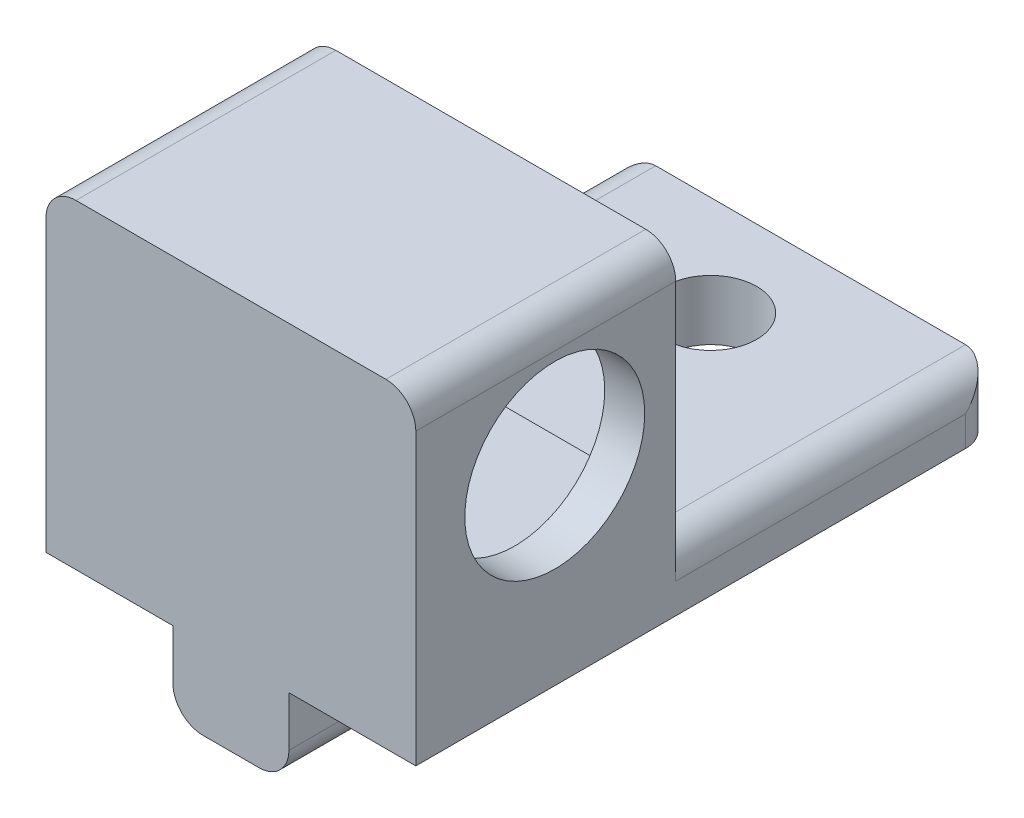
ISO-10303-21;
HEADER;
FILE_DESCRIPTION(('STEP AP214'),'2;1');
FILE_NAME('part.step','',(''),(''),'','','');
FILE_SCHEMA(('AUTOMOTIVE_DESIGN { 1 0 10303 214 1 1 1 1 }'));
ENDSEC;
DATA;
#1=APPLICATION_CONTEXT('core data for automotive mechanical design processes');
#2=APPLICATION_PROTOCOL_DEFINITION('international standard','automotive_design',2000,#1);
#3=PRODUCT_CONTEXT('',#1,'mechanical');
#4=PRODUCT('Part','Part','',(#3));
#5=PRODUCT_RELATED_PRODUCT_CATEGORY('part','',(#4));
#6=PRODUCT_DEFINITION_FORMATION('','',#4);
#7=PRODUCT_DEFINITION_CONTEXT('part definition',#1,'design');
#8=PRODUCT_DEFINITION('design','',#6,#7);
#9=PRODUCT_DEFINITION_SHAPE('','',#8);
#10=(LENGTH_UNIT() NAMED_UNIT(*) SI_UNIT(.MILLI.,.METRE.));
#11=(NAMED_UNIT(*) PLANE_ANGLE_UNIT() SI_UNIT($,.RADIAN.));
#12=(NAMED_UNIT(*) SI_UNIT($,.STERADIAN.) SOLID_ANGLE_UNIT());
#13=UNCERTAINTY_MEASURE_WITH_UNIT(LENGTH_MEASURE(1.E-05),#10,'distance_accuracy_value','');
#14=(GEOMETRIC_REPRESENTATION_CONTEXT(3) GLOBAL_UNCERTAINTY_ASSIGNED_CONTEXT((#13)) GLOBAL_UNIT_ASSIGNED_CONTEXT((#10,
#11,#12)) REPRESENTATION_CONTEXT('',''));
#15=CARTESIAN_POINT('',(0.,0.,0.));
#16=DIRECTION('',(0.,0.,1.));
#17=DIRECTION('',(1.,0.,0.));
#18=AXIS2_PLACEMENT_3D('',#15,#16,#17);
#19=CARTESIAN_POINT('',(0.,0.,0.));
#20=DIRECTION('',(0.,0.,-1.));
#21=DIRECTION('',(-1.,0.,0.));
#22=AXIS2_PLACEMENT_3D('',#19,#20,#21);
#23=PLANE('',#22);
#24=DIRECTION('',(-1.,0.,0.));
#25=VECTOR('',#24,1.);
#26=CARTESIAN_POINT('',(-2.,11.2,0.));
#27=LINE('',#26,#25);
#28=CARTESIAN_POINT('',(15.,11.2,0.));
#29=VERTEX_POINT('',#28);
#30=CARTESIAN_POINT('',(-0.5,11.2,0.));
#31=VERTEX_POINT('',#30);
#32=EDGE_CURVE('E271',#29,#31,#27,.T.);
#33=ORIENTED_EDGE('',*,*,#32,.F.);
#34=CARTESIAN_POINT('',(15.,9.7,0.));
#35=DIRECTION('',(0.,0.,-1.));
#36=DIRECTION('',(-1.,0.,0.));
#37=AXIS2_PLACEMENT_3D('',#34,#35,#36);
#38=CIRCLE('',#37,1.5);
#39=CARTESIAN_POINT('',(16.5,9.7,0.));
#40=VERTEX_POINT('',#39);
#41=EDGE_CURVE('E66',#29,#40,#38,.T.);
#42=ORIENTED_EDGE('',*,*,#41,.T.);
#43=DIRECTION('',(0.,1.,0.));
#44=VECTOR('',#43,1.);
#45=CARTESIAN_POINT('',(16.5,-1.8,0.));
#46=LINE('',#45,#44);
#47=CARTESIAN_POINT('',(16.5,-3.3,0.));
#48=VERTEX_POINT('',#47);
#49=EDGE_CURVE('E268',#48,#40,#46,.T.);
#50=ORIENTED_EDGE('',*,*,#49,.F.);
#51=CARTESIAN_POINT('',(15.,-3.3,0.));
#52=DIRECTION('',(0.,0.,-1.));
#53=DIRECTION('',(-1.,0.,0.));
#54=AXIS2_PLACEMENT_3D('',#51,#52,#53);
#55=CIRCLE('',#54,1.5);
#56=CARTESIAN_POINT('',(15.,-1.8,0.));
#57=VERTEX_POINT('',#56);
#58=EDGE_CURVE('E11',#48,#57,#55,.F.);
#59=ORIENTED_EDGE('',*,*,#58,.T.);
#60=DIRECTION('',(1.,0.,0.));
#61=VECTOR('',#60,1.);
#62=CARTESIAN_POINT('',(-2.,-1.8,0.));
#63=LINE('',#62,#61);
#64=CARTESIAN_POINT('',(-0.5,-1.8,0.));
#65=VERTEX_POINT('',#64);
#66=EDGE_CURVE('E261',#65,#57,#63,.T.);
#67=ORIENTED_EDGE('',*,*,#66,.F.);
#68=CARTESIAN_POINT('',(-0.5,-3.3,0.));
#69=DIRECTION('',(0.,0.,-1.));
#70=DIRECTION('',(-1.,0.,0.));
#71=AXIS2_PLACEMENT_3D('',#68,#69,#70);
#72=CIRCLE('',#71,1.5);
#73=CARTESIAN_POINT('',(-2.,-3.3,0.));
#74=VERTEX_POINT('',#73);
#75=EDGE_CURVE('E50',#65,#74,#72,.F.);
#76=ORIENTED_EDGE('',*,*,#75,.T.);
#77=DIRECTION('',(0.,-1.,0.));
#78=VECTOR('',#77,1.);
#79=CARTESIAN_POINT('',(-2.,-1.8,0.));
#80=LINE('',#79,#78);
#81=CARTESIAN_POINT('',(-2.,9.7,0.));
#82=VERTEX_POINT('',#81);
#83=EDGE_CURVE('E259',#82,#74,#80,.T.);
#84=ORIENTED_EDGE('',*,*,#83,.F.);
#85=CARTESIAN_POINT('',(-0.5,9.7,0.));
#86=DIRECTION('',(0.,0.,-1.));
#87=DIRECTION('',(-1.,0.,0.));
#88=AXIS2_PLACEMENT_3D('',#85,#86,#87);
#89=CIRCLE('',#88,1.5);
#90=EDGE_CURVE('E58',#82,#31,#89,.T.);
#91=ORIENTED_EDGE('',*,*,#90,.T.);
#92=EDGE_LOOP('',(#33,#42,#50,#59,#67,#76,#84,#91));
#93=FACE_BOUND('',#92,.T.);
#94=DIRECTION('',(1.,0.,0.));
#95=VECTOR('',#94,1.);
#96=CARTESIAN_POINT('',(-0.399999999999999,9.5,0.));
#97=LINE('',#96,#95);
#98=CARTESIAN_POINT('',(-0.399999999999999,9.5,0.));
#99=VERTEX_POINT('',#98);
#100=CARTESIAN_POINT('',(14.5,9.5,0.));
#101=VERTEX_POINT('',#100);
#102=EDGE_CURVE('E386',#99,#101,#97,.T.);
#103=ORIENTED_EDGE('',*,*,#102,.F.);
#104=DIRECTION('',(0.,1.,0.));
#105=VECTOR('',#104,1.);
#106=CARTESIAN_POINT('',(-0.399999999999999,0.,0.));
#107=LINE('',#106,#105);
#108=CARTESIAN_POINT('',(-0.399999999999999,0.,0.));
#109=VERTEX_POINT('',#108);
#110=EDGE_CURVE('E376',#109,#99,#107,.T.);
#111=ORIENTED_EDGE('',*,*,#110,.F.);
#112=DIRECTION('',(1.,0.,0.));
#113=VECTOR('',#112,1.);
#114=CARTESIAN_POINT('',(-0.399999999999999,0.,0.));
#115=LINE('',#114,#113);
#116=CARTESIAN_POINT('',(14.5,0.,0.));
#117=VERTEX_POINT('',#116);
#118=EDGE_CURVE('E389',#109,#117,#115,.T.);
#119=ORIENTED_EDGE('',*,*,#118,.T.);
#120=DIRECTION('',(0.,1.,0.));
#121=VECTOR('',#120,1.);
#122=CARTESIAN_POINT('',(14.5,0.,0.));
#123=LINE('',#122,#121);
#124=EDGE_CURVE('E371',#117,#101,#123,.T.);
#125=ORIENTED_EDGE('',*,*,#124,.T.);
#126=EDGE_LOOP('',(#103,#111,#119,#125));
#127=FACE_BOUND('',#126,.T.);
#128=ADVANCED_FACE('F41',(#93,#127),#23,.T.);
#129=CARTESIAN_POINT('',(-2.,-1.8,13.));
#130=DIRECTION('',(1.,0.,0.));
#131=DIRECTION('',(0.,0.,-1.));
#132=AXIS2_PLACEMENT_3D('',#129,#130,#131);
#133=PLANE('',#132);
#134=DIRECTION('',(0.,0.,-1.));
#135=VECTOR('',#134,1.);
#136=CARTESIAN_POINT('',(-2.,-3.3,13.));
#137=LINE('',#136,#135);
#138=CARTESIAN_POINT('',(-2.,-3.3,-14.5));
#139=VERTEX_POINT('',#138);
#140=EDGE_CURVE('E414',#74,#139,#137,.T.);
#141=ORIENTED_EDGE('',*,*,#140,.T.);
#142=DIRECTION('',(0.,1.,0.));
#143=VECTOR('',#142,1.);
#144=CARTESIAN_POINT('',(-2.,-4.8,-14.5));
#145=LINE('',#144,#143);
#146=CARTESIAN_POINT('',(-2.,-4.8,-14.5));
#147=VERTEX_POINT('',#146);
#148=EDGE_CURVE('E415',#139,#147,#145,.F.);
#149=ORIENTED_EDGE('',*,*,#148,.T.);
#150=DIRECTION('',(0.,0.,-1.));
#151=VECTOR('',#150,1.);
#152=CARTESIAN_POINT('',(-2.,-4.8,0.));
#153=LINE('',#152,#151);
#154=CARTESIAN_POINT('',(-2.,-4.8,13.));
#155=VERTEX_POINT('',#154);
#156=EDGE_CURVE('E339',#155,#147,#153,.T.);
#157=ORIENTED_EDGE('',*,*,#156,.F.);
#158=DIRECTION('',(0.,-1.,0.));
#159=VECTOR('',#158,1.);
#160=CARTESIAN_POINT('',(-2.,-1.8,13.));
#161=LINE('',#160,#159);
#162=CARTESIAN_POINT('',(-2.,9.7,13.));
#163=VERTEX_POINT('',#162);
#164=EDGE_CURVE('E276',#163,#155,#161,.T.);
#165=ORIENTED_EDGE('',*,*,#164,.F.);
#166=DIRECTION('',(0.,0.,-1.));
#167=VECTOR('',#166,1.);
#168=CARTESIAN_POINT('',(-2.,9.7,13.));
#169=LINE('',#168,#167);
#170=EDGE_CURVE('E258',#163,#82,#169,.T.);
#171=ORIENTED_EDGE('',*,*,#170,.T.);
#172=ORIENTED_EDGE('',*,*,#83,.T.);
#173=EDGE_LOOP('',(#141,#149,#157,#165,#171,#172));
#174=FACE_BOUND('',#173,.T.);
#175=ADVANCED_FACE('F439',(#174),#133,.F.);
#176=CARTESIAN_POINT('',(16.5,-1.8,13.));
#177=DIRECTION('',(-1.,0.,0.));
#178=DIRECTION('',(0.,0.,1.));
#179=AXIS2_PLACEMENT_3D('',#176,#177,#178);
#180=PLANE('',#179);
#181=CARTESIAN_POINT('',(16.5,4.75,6.05));
#182=DIRECTION('',(1.,0.,0.));
#183=DIRECTION('',(0.,0.,-1.));
#184=AXIS2_PLACEMENT_3D('',#181,#182,#183);
#185=CIRCLE('',#184,4.5);
#186=CARTESIAN_POINT('',(16.5,4.75,1.55));
#187=VERTEX_POINT('',#186);
#188=EDGE_CURVE('E262',#187,#187,#185,.T.);
#189=ORIENTED_EDGE('',*,*,#188,.F.);
#190=EDGE_LOOP('',(#189));
#191=FACE_BOUND('',#190,.T.);
#192=DIRECTION('',(0.,0.,-1.));
#193=VECTOR('',#192,1.);
#194=CARTESIAN_POINT('',(16.5,-4.8,0.));
#195=LINE('',#194,#193);
#196=CARTESIAN_POINT('',(16.5,-4.8,13.));
#197=VERTEX_POINT('',#196);
#198=CARTESIAN_POINT('',(16.5,-4.8,-14.5));
#199=VERTEX_POINT('',#198);
#200=EDGE_CURVE('E325',#197,#199,#195,.T.);
#201=ORIENTED_EDGE('',*,*,#200,.T.);
#202=DIRECTION('',(0.,1.,0.));
#203=VECTOR('',#202,1.);
#204=CARTESIAN_POINT('',(16.5,-1.8,-14.5));
#205=LINE('',#204,#203);
#206=CARTESIAN_POINT('',(16.5,-3.3,-14.5));
#207=VERTEX_POINT('',#206);
#208=EDGE_CURVE('E284',#199,#207,#205,.T.);
#209=ORIENTED_EDGE('',*,*,#208,.T.);
#210=DIRECTION('',(0.,0.,-1.));
#211=VECTOR('',#210,1.);
#212=CARTESIAN_POINT('',(16.5,-3.3,13.));
#213=LINE('',#212,#211);
#214=EDGE_CURVE('E318',#207,#48,#213,.F.);
#215=ORIENTED_EDGE('',*,*,#214,.T.);
#216=ORIENTED_EDGE('',*,*,#49,.T.);
#217=DIRECTION('',(0.,0.,-1.));
#218=VECTOR('',#217,1.);
#219=CARTESIAN_POINT('',(16.5,9.7,13.));
#220=LINE('',#219,#218);
#221=CARTESIAN_POINT('',(16.5,9.7,13.));
#222=VERTEX_POINT('',#221);
#223=EDGE_CURVE('E321',#40,#222,#220,.F.);
#224=ORIENTED_EDGE('',*,*,#223,.T.);
#225=DIRECTION('',(0.,1.,0.));
#226=VECTOR('',#225,1.);
#227=CARTESIAN_POINT('',(16.5,-1.8,13.));
#228=LINE('',#227,#226);
#229=EDGE_CURVE('E327',#197,#222,#228,.T.);
#230=ORIENTED_EDGE('',*,*,#229,.F.);
#231=EDGE_LOOP('',(#201,#209,#215,#216,#224,#230));
#232=FACE_BOUND('',#231,.T.);
#233=ADVANCED_FACE('F323',(#191,#232),#180,.F.);
#234=CARTESIAN_POINT('',(-2.,11.2,13.));
#235=DIRECTION('',(0.,-1.,0.));
#236=DIRECTION('',(0.,0.,-1.));
#237=AXIS2_PLACEMENT_3D('',#234,#235,#236);
#238=PLANE('',#237);
#239=DIRECTION('',(-1.,0.,0.));
#240=VECTOR('',#239,1.);
#241=CARTESIAN_POINT('',(-2.,11.2,13.));
#242=LINE('',#241,#240);
#243=CARTESIAN_POINT('',(15.,11.2,13.));
#244=VERTEX_POINT('',#243);
#245=CARTESIAN_POINT('',(-0.5,11.2,13.));
#246=VERTEX_POINT('',#245);
#247=EDGE_CURVE('E274',#244,#246,#242,.T.);
#248=ORIENTED_EDGE('',*,*,#247,.F.);
#249=DIRECTION('',(0.,0.,-1.));
#250=VECTOR('',#249,1.);
#251=CARTESIAN_POINT('',(15.,11.2,13.));
#252=LINE('',#251,#250);
#253=EDGE_CURVE('E292',#244,#29,#252,.T.);
#254=ORIENTED_EDGE('',*,*,#253,.T.);
#255=ORIENTED_EDGE('',*,*,#32,.T.);
#256=DIRECTION('',(0.,0.,-1.));
#257=VECTOR('',#256,1.);
#258=CARTESIAN_POINT('',(-0.5,11.2,13.));
#259=LINE('',#258,#257);
#260=EDGE_CURVE('E290',#31,#246,#259,.F.);
#261=ORIENTED_EDGE('',*,*,#260,.T.);
#262=EDGE_LOOP('',(#248,#254,#255,#261));
#263=FACE_BOUND('',#262,.T.);
#264=ADVANCED_FACE('F424',(#263),#238,.F.);
#265=CARTESIAN_POINT('',(0.,0.,13.));
#266=DIRECTION('',(0.,0.,-1.));
#267=DIRECTION('',(-1.,0.,0.));
#268=AXIS2_PLACEMENT_3D('',#265,#266,#267);
#269=PLANE('',#268);
#270=DIRECTION('',(-1.,0.,0.));
#271=VECTOR('',#270,1.);
#272=CARTESIAN_POINT('',(0.,-8.8,13.));
#273=LINE('',#272,#271);
#274=CARTESIAN_POINT('',(8.65,-8.8,13.));
#275=VERTEX_POINT('',#274);
#276=CARTESIAN_POINT('',(5.85,-8.8,13.));
#277=VERTEX_POINT('',#276);
#278=EDGE_CURVE('E211',#275,#277,#273,.T.);
#279=ORIENTED_EDGE('',*,*,#278,.F.);
#280=CARTESIAN_POINT('',(8.65,-7.3,13.));
#281=DIRECTION('',(0.,0.,-1.));
#282=DIRECTION('',(-1.,0.,0.));
#283=AXIS2_PLACEMENT_3D('',#280,#281,#282);
#284=CIRCLE('',#283,1.5);
#285=CARTESIAN_POINT('',(10.15,-7.3,13.));
#286=VERTEX_POINT('',#285);
#287=EDGE_CURVE('E249',#275,#286,#284,.F.);
#288=ORIENTED_EDGE('',*,*,#287,.T.);
#289=DIRECTION('',(0.,1.,0.));
#290=VECTOR('',#289,1.);
#291=CARTESIAN_POINT('',(10.15,-8.8,13.));
#292=LINE('',#291,#290);
#293=CARTESIAN_POINT('',(10.15,-4.8,13.));
#294=VERTEX_POINT('',#293);
#295=EDGE_CURVE('E442',#286,#294,#292,.T.);
#296=ORIENTED_EDGE('',*,*,#295,.T.);
#297=DIRECTION('',(-1.,0.,0.));
#298=VECTOR('',#297,1.);
#299=CARTESIAN_POINT('',(0.,-4.8,13.));
#300=LINE('',#299,#298);
#301=EDGE_CURVE('E332',#197,#294,#300,.T.);
#302=ORIENTED_EDGE('',*,*,#301,.F.);
#303=ORIENTED_EDGE('',*,*,#229,.T.);
#304=CARTESIAN_POINT('',(15.,9.7,13.));
#305=DIRECTION('',(0.,0.,-1.));
#306=DIRECTION('',(-1.,0.,0.));
#307=AXIS2_PLACEMENT_3D('',#304,#305,#306);
#308=CIRCLE('',#307,1.5);
#309=EDGE_CURVE('E245',#222,#244,#308,.F.);
#310=ORIENTED_EDGE('',*,*,#309,.T.);
#311=ORIENTED_EDGE('',*,*,#247,.T.);
#312=CARTESIAN_POINT('',(-0.5,9.7,13.));
#313=DIRECTION('',(0.,0.,-1.));
#314=DIRECTION('',(-1.,0.,0.));
#315=AXIS2_PLACEMENT_3D('',#312,#313,#314);
#316=CIRCLE('',#315,1.5);
#317=EDGE_CURVE('E243',#246,#163,#316,.F.);
#318=ORIENTED_EDGE('',*,*,#317,.T.);
#319=ORIENTED_EDGE('',*,*,#164,.T.);
#320=CARTESIAN_POINT('',(4.35,-4.8,13.));
#321=VERTEX_POINT('',#320);
#322=EDGE_CURVE('E329',#321,#155,#300,.T.);
#323=ORIENTED_EDGE('',*,*,#322,.F.);
#324=DIRECTION('',(0.,1.,0.));
#325=VECTOR('',#324,1.);
#326=CARTESIAN_POINT('',(4.35,-8.8,13.));
#327=LINE('',#326,#325);
#328=CARTESIAN_POINT('',(4.35,-7.3,13.));
#329=VERTEX_POINT('',#328);
#330=EDGE_CURVE('E210',#329,#321,#327,.T.);
#331=ORIENTED_EDGE('',*,*,#330,.F.);
#332=CARTESIAN_POINT('',(5.85,-7.3,13.));
#333=DIRECTION('',(0.,0.,-1.));
#334=DIRECTION('',(-1.,0.,0.));
#335=AXIS2_PLACEMENT_3D('',#332,#333,#334);
#336=CIRCLE('',#335,1.5);
#337=EDGE_CURVE('E247',#329,#277,#336,.F.);
#338=ORIENTED_EDGE('',*,*,#337,.T.);
#339=EDGE_LOOP('',(#279,#288,#296,#302,#303,#310,#311,#318,#319,#323,#331,#338));
#340=FACE_BOUND('',#339,.T.);
#341=ADVANCED_FACE('F406',(#340),#269,.F.);
#342=CARTESIAN_POINT('',(14.5,4.75,6.05));
#343=DIRECTION('',(1.,0.,0.));
#344=DIRECTION('',(0.,0.,-1.));
#345=AXIS2_PLACEMENT_3D('',#342,#343,#344);
#346=CYLINDRICAL_SURFACE('',#345,4.5);
#347=CARTESIAN_POINT('',(14.5,4.75,6.05));
#348=DIRECTION('',(1.,0.,0.));
#349=DIRECTION('',(0.,0.,-1.));
#350=AXIS2_PLACEMENT_3D('',#347,#348,#349);
#351=CIRCLE('',#350,4.5);
#352=CARTESIAN_POINT('',(14.5,4.75,1.55));
#353=VERTEX_POINT('',#352);
#354=EDGE_CURVE('E388',#353,#353,#351,.F.);
#355=ORIENTED_EDGE('',*,*,#354,.T.);
#356=EDGE_LOOP('',(#355));
#357=FACE_BOUND('',#356,.T.);
#358=ORIENTED_EDGE('',*,*,#188,.T.);
#359=EDGE_LOOP('',(#358));
#360=FACE_BOUND('',#359,.T.);
#361=ADVANCED_FACE('F607',(#357,#360),#346,.F.);
#362=CARTESIAN_POINT('',(14.5,0.,0.));
#363=DIRECTION('',(1.,0.,0.));
#364=DIRECTION('',(0.,0.,-1.));
#365=AXIS2_PLACEMENT_3D('',#362,#363,#364);
#366=PLANE('',#365);
#367=DIRECTION('',(0.,0.,-1.));
#368=VECTOR('',#367,1.);
#369=CARTESIAN_POINT('',(14.5,9.5,0.));
#370=LINE('',#369,#368);
#371=CARTESIAN_POINT('',(14.5,9.5,11.7));
#372=VERTEX_POINT('',#371);
#373=EDGE_CURVE('E366',#372,#101,#370,.T.);
#374=ORIENTED_EDGE('',*,*,#373,.T.);
#375=ORIENTED_EDGE('',*,*,#124,.F.);
#376=DIRECTION('',(0.,0.,1.));
#377=VECTOR('',#376,1.);
#378=CARTESIAN_POINT('',(14.5,0.,0.));
#379=LINE('',#378,#377);
#380=CARTESIAN_POINT('',(14.5,0.,11.7));
#381=VERTEX_POINT('',#380);
#382=EDGE_CURVE('E382',#117,#381,#379,.T.);
#383=ORIENTED_EDGE('',*,*,#382,.T.);
#384=DIRECTION('',(0.,-1.,0.));
#385=VECTOR('',#384,1.);
#386=CARTESIAN_POINT('',(14.5,9.5,11.7));
#387=LINE('',#386,#385);
#388=EDGE_CURVE('E344',#372,#381,#387,.T.);
#389=ORIENTED_EDGE('',*,*,#388,.F.);
#390=EDGE_LOOP('',(#374,#375,#383,#389));
#391=FACE_BOUND('',#390,.T.);
#392=ORIENTED_EDGE('',*,*,#354,.F.);
#393=EDGE_LOOP('',(#392));
#394=FACE_BOUND('',#393,.T.);
#395=ADVANCED_FACE('F696',(#391,#394),#366,.F.);
#396=CARTESIAN_POINT('',(-0.399999999999999,9.5,0.));
#397=DIRECTION('',(0.,-1.,0.));
#398=DIRECTION('',(0.,0.,-1.));
#399=AXIS2_PLACEMENT_3D('',#396,#397,#398);
#400=PLANE('',#399);
#401=ORIENTED_EDGE('',*,*,#102,.T.);
#402=ORIENTED_EDGE('',*,*,#373,.F.);
#403=DIRECTION('',(1.,0.,0.));
#404=VECTOR('',#403,1.);
#405=CARTESIAN_POINT('',(14.5,9.5,11.7));
#406=LINE('',#405,#404);
#407=CARTESIAN_POINT('',(11.,9.5,11.7));
#408=VERTEX_POINT('',#407);
#409=EDGE_CURVE('E359',#408,#372,#406,.T.);
#410=ORIENTED_EDGE('',*,*,#409,.F.);
#411=DIRECTION('',(0.,0.,-1.));
#412=VECTOR('',#411,1.);
#413=CARTESIAN_POINT('',(11.,9.5,11.7));
#414=LINE('',#413,#412);
#415=CARTESIAN_POINT('',(11.,9.5,6.05));
#416=VERTEX_POINT('',#415);
#417=EDGE_CURVE('E363',#408,#416,#414,.T.);
#418=ORIENTED_EDGE('',*,*,#417,.T.);
#419=DIRECTION('',(1.,0.,0.));
#420=VECTOR('',#419,1.);
#421=CARTESIAN_POINT('',(-0.399999999999999,9.5,6.05));
#422=LINE('',#421,#420);
#423=CARTESIAN_POINT('',(-0.399999999999999,9.5,6.05));
#424=VERTEX_POINT('',#423);
#425=EDGE_CURVE('E379',#424,#416,#422,.T.);
#426=ORIENTED_EDGE('',*,*,#425,.F.);
#427=DIRECTION('',(0.,0.,-1.));
#428=VECTOR('',#427,1.);
#429=CARTESIAN_POINT('',(-0.399999999999999,9.5,0.));
#430=LINE('',#429,#428);
#431=EDGE_CURVE('E368',#424,#99,#430,.T.);
#432=ORIENTED_EDGE('',*,*,#431,.T.);
#433=EDGE_LOOP('',(#401,#402,#410,#418,#426,#432));
#434=FACE_BOUND('',#433,.T.);
#435=ADVANCED_FACE('F686',(#434),#400,.T.);
#436=CARTESIAN_POINT('',(-0.399999999999999,0.,0.));
#437=DIRECTION('',(0.,1.,0.));
#438=DIRECTION('',(0.,0.,1.));
#439=AXIS2_PLACEMENT_3D('',#436,#437,#438);
#440=PLANE('',#439);
#441=DIRECTION('',(1.,0.,0.));
#442=VECTOR('',#441,1.);
#443=CARTESIAN_POINT('',(-0.399999999999999,0.,6.05));
#444=LINE('',#443,#442);
#445=CARTESIAN_POINT('',(-0.399999999999999,0.,6.05));
#446=VERTEX_POINT('',#445);
#447=CARTESIAN_POINT('',(11.,0.,6.05));
#448=VERTEX_POINT('',#447);
#449=EDGE_CURVE('E391',#446,#448,#444,.T.);
#450=ORIENTED_EDGE('',*,*,#449,.T.);
#451=DIRECTION('',(0.,0.,-1.));
#452=VECTOR('',#451,1.);
#453=CARTESIAN_POINT('',(11.,0.,11.7));
#454=LINE('',#453,#452);
#455=CARTESIAN_POINT('',(11.,0.,11.7));
#456=VERTEX_POINT('',#455);
#457=EDGE_CURVE('E362',#456,#448,#454,.T.);
#458=ORIENTED_EDGE('',*,*,#457,.F.);
#459=DIRECTION('',(-1.,0.,0.));
#460=VECTOR('',#459,1.);
#461=CARTESIAN_POINT('',(14.5,0.,11.7));
#462=LINE('',#461,#460);
#463=EDGE_CURVE('E353',#381,#456,#462,.T.);
#464=ORIENTED_EDGE('',*,*,#463,.F.);
#465=ORIENTED_EDGE('',*,*,#382,.F.);
#466=ORIENTED_EDGE('',*,*,#118,.F.);
#467=DIRECTION('',(0.,0.,1.));
#468=VECTOR('',#467,1.);
#469=CARTESIAN_POINT('',(-0.399999999999999,0.,0.));
#470=LINE('',#469,#468);
#471=EDGE_CURVE('E374',#109,#446,#470,.T.);
#472=ORIENTED_EDGE('',*,*,#471,.T.);
#473=EDGE_LOOP('',(#450,#458,#464,#465,#466,#472));
#474=FACE_BOUND('',#473,.T.);
#475=ADVANCED_FACE('F675',(#474),#440,.T.);
#476=CARTESIAN_POINT('',(-0.399999999999999,4.75,6.05));
#477=DIRECTION('',(1.,0.,0.));
#478=DIRECTION('',(0.,0.,-1.));
#479=AXIS2_PLACEMENT_3D('',#476,#477,#478);
#480=CYLINDRICAL_SURFACE('',#479,4.75);
#481=ORIENTED_EDGE('',*,*,#425,.T.);
#482=CARTESIAN_POINT('',(11.,4.75,6.05));
#483=DIRECTION('',(-1.,0.,0.));
#484=DIRECTION('',(0.,-1.,0.));
#485=AXIS2_PLACEMENT_3D('',#482,#483,#484);
#486=CIRCLE('',#485,4.75);
#487=EDGE_CURVE('E220',#416,#448,#486,.F.);
#488=ORIENTED_EDGE('',*,*,#487,.T.);
#489=ORIENTED_EDGE('',*,*,#449,.F.);
#490=CARTESIAN_POINT('',(-0.399999999999999,4.75,6.05));
#491=DIRECTION('',(1.,0.,0.));
#492=DIRECTION('',(0.,0.,-1.));
#493=AXIS2_PLACEMENT_3D('',#490,#491,#492);
#494=CIRCLE('',#493,4.75);
#495=EDGE_CURVE('E370',#424,#446,#494,.T.);
#496=ORIENTED_EDGE('',*,*,#495,.F.);
#497=EDGE_LOOP('',(#481,#488,#489,#496));
#498=FACE_BOUND('',#497,.T.);
#499=ADVANCED_FACE('F670',(#498),#480,.F.);
#500=CARTESIAN_POINT('',(-0.399999999999999,0.,0.));
#501=DIRECTION('',(1.,0.,0.));
#502=DIRECTION('',(0.,0.,-1.));
#503=AXIS2_PLACEMENT_3D('',#500,#501,#502);
#504=PLANE('',#503);
#505=ORIENTED_EDGE('',*,*,#431,.F.);
#506=ORIENTED_EDGE('',*,*,#495,.T.);
#507=ORIENTED_EDGE('',*,*,#471,.F.);
#508=ORIENTED_EDGE('',*,*,#110,.T.);
#509=EDGE_LOOP('',(#505,#506,#507,#508));
#510=FACE_BOUND('',#509,.T.);
#511=ADVANCED_FACE('F662',(#510),#504,.T.);
#512=CARTESIAN_POINT('',(11.,9.5,11.7));
#513=DIRECTION('',(-1.,0.,0.));
#514=DIRECTION('',(0.,-1.,0.));
#515=AXIS2_PLACEMENT_3D('',#512,#513,#514);
#516=PLANE('',#515);
#517=ORIENTED_EDGE('',*,*,#417,.F.);
#518=DIRECTION('',(0.,1.,0.));
#519=VECTOR('',#518,1.);
#520=CARTESIAN_POINT('',(11.,9.5,11.7));
#521=LINE('',#520,#519);
#522=EDGE_CURVE('E356',#456,#408,#521,.T.);
#523=ORIENTED_EDGE('',*,*,#522,.F.);
#524=ORIENTED_EDGE('',*,*,#457,.T.);
#525=ORIENTED_EDGE('',*,*,#487,.F.);
#526=EDGE_LOOP('',(#517,#523,#524,#525));
#527=FACE_BOUND('',#526,.T.);
#528=ADVANCED_FACE('F652',(#527),#516,.F.);
#529=CARTESIAN_POINT('',(0.,0.,11.7));
#530=DIRECTION('',(0.,0.,-1.));
#531=DIRECTION('',(-1.,0.,0.));
#532=AXIS2_PLACEMENT_3D('',#529,#530,#531);
#533=PLANE('',#532);
#534=ORIENTED_EDGE('',*,*,#388,.T.);
#535=ORIENTED_EDGE('',*,*,#463,.T.);
#536=ORIENTED_EDGE('',*,*,#522,.T.);
#537=ORIENTED_EDGE('',*,*,#409,.T.);
#538=EDGE_LOOP('',(#534,#535,#536,#537));
#539=FACE_BOUND('',#538,.T.);
#540=ADVANCED_FACE('F595',(#539),#533,.T.);
#541=CARTESIAN_POINT('',(0.,-1.8,0.));
#542=DIRECTION('',(0.,-1.,0.));
#543=DIRECTION('',(0.,0.,-1.));
#544=AXIS2_PLACEMENT_3D('',#541,#542,#543);
#545=PLANE('',#544);
#546=CARTESIAN_POINT('',(7.25,-1.8,-11.));
#547=DIRECTION('',(0.,-1.,0.));
#548=DIRECTION('',(0.,0.,-1.));
#549=AXIS2_PLACEMENT_3D('',#546,#547,#548);
#550=CIRCLE('',#549,2.3);
#551=CARTESIAN_POINT('',(7.25,-1.8,-13.3));
#552=VERTEX_POINT('',#551);
#553=EDGE_CURVE('E345',#552,#552,#550,.F.);
#554=ORIENTED_EDGE('',*,*,#553,.F.);
#555=EDGE_LOOP('',(#554));
#556=FACE_BOUND('',#555,.T.);
#557=DIRECTION('',(-1.,0.,0.));
#558=VECTOR('',#557,1.);
#559=CARTESIAN_POINT('',(0.,-1.8,-16.));
#560=LINE('',#559,#558);
#561=CARTESIAN_POINT('',(15.,-1.8,-16.));
#562=VERTEX_POINT('',#561);
#563=CARTESIAN_POINT('',(-0.5,-1.8,-16.));
#564=VERTEX_POINT('',#563);
#565=EDGE_CURVE('E335',#562,#564,#560,.T.);
#566=ORIENTED_EDGE('',*,*,#565,.T.);
#567=DIRECTION('',(0.,0.,-1.));
#568=VECTOR('',#567,1.);
#569=CARTESIAN_POINT('',(-0.5,-1.8,0.));
#570=LINE('',#569,#568);
#571=EDGE_CURVE('E288',#564,#65,#570,.F.);
#572=ORIENTED_EDGE('',*,*,#571,.T.);
#573=ORIENTED_EDGE('',*,*,#66,.T.);
#574=DIRECTION('',(0.,0.,-1.));
#575=VECTOR('',#574,1.);
#576=CARTESIAN_POINT('',(15.,-1.8,0.));
#577=LINE('',#576,#575);
#578=EDGE_CURVE('E286',#57,#562,#577,.T.);
#579=ORIENTED_EDGE('',*,*,#578,.T.);
#580=EDGE_LOOP('',(#566,#572,#573,#579));
#581=FACE_BOUND('',#580,.T.);
#582=ADVANCED_FACE('F429',(#556,#581),#545,.F.);
#583=CARTESIAN_POINT('',(7.25,-4.8,-11.));
#584=DIRECTION('',(0.,1.,0.));
#585=DIRECTION('',(0.,0.,1.));
#586=AXIS2_PLACEMENT_3D('',#583,#584,#585);
#587=CYLINDRICAL_SURFACE('',#586,2.3);
#588=CARTESIAN_POINT('',(7.25,-4.8,-11.));
#589=DIRECTION('',(0.,-1.,0.));
#590=DIRECTION('',(0.,0.,-1.));
#591=AXIS2_PLACEMENT_3D('',#588,#589,#590);
#592=CIRCLE('',#591,2.3);
#593=CARTESIAN_POINT('',(7.25,-4.8,-13.3));
#594=VERTEX_POINT('',#593);
#595=EDGE_CURVE('E330',#594,#594,#592,.F.);
#596=ORIENTED_EDGE('',*,*,#595,.F.);
#597=EDGE_LOOP('',(#596));
#598=FACE_BOUND('',#597,.T.);
#599=ORIENTED_EDGE('',*,*,#553,.T.);
#600=EDGE_LOOP('',(#599));
#601=FACE_BOUND('',#600,.T.);
#602=ADVANCED_FACE('F583',(#598,#601),#587,.F.);
#603=CARTESIAN_POINT('',(0.,-4.8,-16.));
#604=DIRECTION('',(0.,0.,-1.));
#605=DIRECTION('',(-1.,0.,0.));
#606=AXIS2_PLACEMENT_3D('',#603,#604,#605);
#607=PLANE('',#606);
#608=DIRECTION('',(-1.,0.,0.));
#609=VECTOR('',#608,1.);
#610=CARTESIAN_POINT('',(0.,-4.8,-16.));
#611=LINE('',#610,#609);
#612=CARTESIAN_POINT('',(15.,-4.8,-16.));
#613=VERTEX_POINT('',#612);
#614=CARTESIAN_POINT('',(-0.5,-4.8,-16.));
#615=VERTEX_POINT('',#614);
#616=EDGE_CURVE('E341',#613,#615,#611,.T.);
#617=ORIENTED_EDGE('',*,*,#616,.T.);
#618=DIRECTION('',(0.,1.,0.));
#619=VECTOR('',#618,1.);
#620=CARTESIAN_POINT('',(-0.5,-1.8,-16.));
#621=LINE('',#620,#619);
#622=EDGE_CURVE('E255',#615,#564,#621,.T.);
#623=ORIENTED_EDGE('',*,*,#622,.T.);
#624=ORIENTED_EDGE('',*,*,#565,.F.);
#625=DIRECTION('',(0.,1.,0.));
#626=VECTOR('',#625,1.);
#627=CARTESIAN_POINT('',(15.,-4.8,-16.));
#628=LINE('',#627,#626);
#629=EDGE_CURVE('E253',#562,#613,#628,.F.);
#630=ORIENTED_EDGE('',*,*,#629,.T.);
#631=EDGE_LOOP('',(#617,#623,#624,#630));
#632=FACE_BOUND('',#631,.T.);
#633=ADVANCED_FACE('F434',(#632),#607,.T.);
#634=CARTESIAN_POINT('',(0.,-4.8,0.));
#635=DIRECTION('',(0.,-1.,0.));
#636=DIRECTION('',(0.,0.,-1.));
#637=AXIS2_PLACEMENT_3D('',#634,#635,#636);
#638=PLANE('',#637);
#639=ORIENTED_EDGE('',*,*,#156,.T.);
#640=CARTESIAN_POINT('',(-0.5,-4.8,-14.5));
#641=DIRECTION('',(0.,-1.,0.));
#642=DIRECTION('',(0.,0.,-1.));
#643=AXIS2_PLACEMENT_3D('',#640,#641,#642);
#644=CIRCLE('',#643,1.5);
#645=EDGE_CURVE('E421',#147,#615,#644,.T.);
#646=ORIENTED_EDGE('',*,*,#645,.T.);
#647=ORIENTED_EDGE('',*,*,#616,.F.);
#648=CARTESIAN_POINT('',(15.,-4.8,-14.5));
#649=DIRECTION('',(0.,-1.,0.));
#650=DIRECTION('',(0.,0.,-1.));
#651=AXIS2_PLACEMENT_3D('',#648,#649,#650);
#652=CIRCLE('',#651,1.5);
#653=EDGE_CURVE('E417',#613,#199,#652,.T.);
#654=ORIENTED_EDGE('',*,*,#653,.T.);
#655=ORIENTED_EDGE('',*,*,#200,.F.);
#656=ORIENTED_EDGE('',*,*,#301,.T.);
#657=DIRECTION('',(0.,0.,1.));
#658=VECTOR('',#657,1.);
#659=CARTESIAN_POINT('',(10.15,-4.8,0.));
#660=LINE('',#659,#658);
#661=CARTESIAN_POINT('',(10.15,-4.8,0.));
#662=VERTEX_POINT('',#661);
#663=EDGE_CURVE('E227',#662,#294,#660,.T.);
#664=ORIENTED_EDGE('',*,*,#663,.F.);
#665=DIRECTION('',(-1.,0.,0.));
#666=VECTOR('',#665,1.);
#667=CARTESIAN_POINT('',(0.,-4.8,0.));
#668=LINE('',#667,#666);
#669=CARTESIAN_POINT('',(4.35,-4.8,0.));
#670=VERTEX_POINT('',#669);
#671=EDGE_CURVE('E204',#662,#670,#668,.T.);
#672=ORIENTED_EDGE('',*,*,#671,.T.);
#673=DIRECTION('',(0.,0.,1.));
#674=VECTOR('',#673,1.);
#675=CARTESIAN_POINT('',(4.35,-4.8,0.));
#676=LINE('',#675,#674);
#677=EDGE_CURVE('E214',#670,#321,#676,.T.);
#678=ORIENTED_EDGE('',*,*,#677,.T.);
#679=ORIENTED_EDGE('',*,*,#322,.T.);
#680=EDGE_LOOP('',(#639,#646,#647,#654,#655,#656,#664,#672,#678,#679));
#681=FACE_BOUND('',#680,.T.);
#682=ORIENTED_EDGE('',*,*,#595,.T.);
#683=EDGE_LOOP('',(#682));
#684=FACE_BOUND('',#683,.T.);
#685=ADVANCED_FACE('F223',(#681,#684),#638,.T.);
#686=CARTESIAN_POINT('',(0.,-8.8,0.));
#687=DIRECTION('',(0.,0.,1.));
#688=DIRECTION('',(1.,0.,0.));
#689=AXIS2_PLACEMENT_3D('',#686,#687,#688);
#690=PLANE('',#689);
#691=DIRECTION('',(0.,1.,0.));
#692=VECTOR('',#691,1.);
#693=CARTESIAN_POINT('',(10.15,-8.8,0.));
#694=LINE('',#693,#692);
#695=CARTESIAN_POINT('',(10.15,-7.3,0.));
#696=VERTEX_POINT('',#695);
#697=EDGE_CURVE('E348',#696,#662,#694,.T.);
#698=ORIENTED_EDGE('',*,*,#697,.F.);
#699=CARTESIAN_POINT('',(8.65,-7.3,0.));
#700=DIRECTION('',(0.,0.,1.));
#701=DIRECTION('',(1.,0.,0.));
#702=AXIS2_PLACEMENT_3D('',#699,#700,#701);
#703=CIRCLE('',#702,1.5);
#704=CARTESIAN_POINT('',(8.65,-8.8,0.));
#705=VERTEX_POINT('',#704);
#706=EDGE_CURVE('E236',#696,#705,#703,.F.);
#707=ORIENTED_EDGE('',*,*,#706,.T.);
#708=DIRECTION('',(1.,0.,0.));
#709=VECTOR('',#708,1.);
#710=CARTESIAN_POINT('',(0.,-8.8,0.));
#711=LINE('',#710,#709);
#712=CARTESIAN_POINT('',(5.85,-8.8,0.));
#713=VERTEX_POINT('',#712);
#714=EDGE_CURVE('E298',#713,#705,#711,.T.);
#715=ORIENTED_EDGE('',*,*,#714,.F.);
#716=CARTESIAN_POINT('',(5.85,-7.3,0.));
#717=DIRECTION('',(0.,0.,1.));
#718=DIRECTION('',(1.,0.,0.));
#719=AXIS2_PLACEMENT_3D('',#716,#717,#718);
#720=CIRCLE('',#719,1.5);
#721=CARTESIAN_POINT('',(4.35,-7.3,0.));
#722=VERTEX_POINT('',#721);
#723=EDGE_CURVE('E207',#713,#722,#720,.F.);
#724=ORIENTED_EDGE('',*,*,#723,.T.);
#725=DIRECTION('',(0.,1.,0.));
#726=VECTOR('',#725,1.);
#727=CARTESIAN_POINT('',(4.35,-8.8,0.));
#728=LINE('',#727,#726);
#729=EDGE_CURVE('E199',#722,#670,#728,.T.);
#730=ORIENTED_EDGE('',*,*,#729,.T.);
#731=ORIENTED_EDGE('',*,*,#671,.F.);
#732=EDGE_LOOP('',(#698,#707,#715,#724,#730,#731));
#733=FACE_BOUND('',#732,.T.);
#734=ADVANCED_FACE('F202',(#733),#690,.F.);
#735=CARTESIAN_POINT('',(10.15,-8.8,0.));
#736=DIRECTION('',(1.,0.,0.));
#737=DIRECTION('',(0.,0.,-1.));
#738=AXIS2_PLACEMENT_3D('',#735,#736,#737);
#739=PLANE('',#738);
#740=ORIENTED_EDGE('',*,*,#295,.F.);
#741=DIRECTION('',(0.,0.,-1.));
#742=VECTOR('',#741,1.);
#743=CARTESIAN_POINT('',(10.15,-7.3,0.));
#744=LINE('',#743,#742);
#745=EDGE_CURVE('E229',#286,#696,#744,.T.);
#746=ORIENTED_EDGE('',*,*,#745,.T.);
#747=ORIENTED_EDGE('',*,*,#697,.T.);
#748=ORIENTED_EDGE('',*,*,#663,.T.);
#749=EDGE_LOOP('',(#740,#746,#747,#748));
#750=FACE_BOUND('',#749,.T.);
#751=ADVANCED_FACE('F456',(#750),#739,.T.);
#752=CARTESIAN_POINT('',(4.35,-8.8,0.));
#753=DIRECTION('',(1.,0.,0.));
#754=DIRECTION('',(0.,0.,-1.));
#755=AXIS2_PLACEMENT_3D('',#752,#753,#754);
#756=PLANE('',#755);
#757=ORIENTED_EDGE('',*,*,#729,.F.);
#758=DIRECTION('',(0.,0.,-1.));
#759=VECTOR('',#758,1.);
#760=CARTESIAN_POINT('',(4.35,-7.3,13.));
#761=LINE('',#760,#759);
#762=EDGE_CURVE('E251',#722,#329,#761,.F.);
#763=ORIENTED_EDGE('',*,*,#762,.T.);
#764=ORIENTED_EDGE('',*,*,#330,.T.);
#765=ORIENTED_EDGE('',*,*,#677,.F.);
#766=EDGE_LOOP('',(#757,#763,#764,#765));
#767=FACE_BOUND('',#766,.T.);
#768=ADVANCED_FACE('F215',(#767),#756,.F.);
#769=CARTESIAN_POINT('',(0.,-8.8,0.));
#770=DIRECTION('',(0.,-1.,0.));
#771=DIRECTION('',(0.,0.,-1.));
#772=AXIS2_PLACEMENT_3D('',#769,#770,#771);
#773=PLANE('',#772);
#774=ORIENTED_EDGE('',*,*,#714,.T.);
#775=DIRECTION('',(0.,0.,-1.));
#776=VECTOR('',#775,1.);
#777=CARTESIAN_POINT('',(8.65,-8.8,0.));
#778=LINE('',#777,#776);
#779=EDGE_CURVE('E241',#705,#275,#778,.F.);
#780=ORIENTED_EDGE('',*,*,#779,.T.);
#781=ORIENTED_EDGE('',*,*,#278,.T.);
#782=DIRECTION('',(0.,0.,-1.));
#783=VECTOR('',#782,1.);
#784=CARTESIAN_POINT('',(5.85,-8.8,0.));
#785=LINE('',#784,#783);
#786=EDGE_CURVE('E238',#277,#713,#785,.T.);
#787=ORIENTED_EDGE('',*,*,#786,.T.);
#788=EDGE_LOOP('',(#774,#780,#781,#787));
#789=FACE_BOUND('',#788,.T.);
#790=ADVANCED_FACE('F448',(#789),#773,.T.);
#791=CARTESIAN_POINT('',(8.65,-7.3,0.));
#792=DIRECTION('',(0.,0.,-1.));
#793=DIRECTION('',(-1.,0.,0.));
#794=AXIS2_PLACEMENT_3D('',#791,#792,#793);
#795=CYLINDRICAL_SURFACE('',#794,1.5);
#796=ORIENTED_EDGE('',*,*,#287,.F.);
#797=ORIENTED_EDGE('',*,*,#779,.F.);
#798=ORIENTED_EDGE('',*,*,#706,.F.);
#799=ORIENTED_EDGE('',*,*,#745,.F.);
#800=EDGE_LOOP('',(#796,#797,#798,#799));
#801=FACE_BOUND('',#800,.T.);
#802=ADVANCED_FACE('F453',(#801),#795,.T.);
#803=CARTESIAN_POINT('',(5.85,-7.3,0.));
#804=DIRECTION('',(0.,0.,1.));
#805=DIRECTION('',(1.,0.,0.));
#806=AXIS2_PLACEMENT_3D('',#803,#804,#805);
#807=CYLINDRICAL_SURFACE('',#806,1.5);
#808=ORIENTED_EDGE('',*,*,#337,.F.);
#809=ORIENTED_EDGE('',*,*,#762,.F.);
#810=ORIENTED_EDGE('',*,*,#723,.F.);
#811=ORIENTED_EDGE('',*,*,#786,.F.);
#812=EDGE_LOOP('',(#808,#809,#810,#811));
#813=FACE_BOUND('',#812,.T.);
#814=ADVANCED_FACE('F446',(#813),#807,.T.);
#815=CARTESIAN_POINT('',(-0.5,-3.3,13.));
#816=DIRECTION('',(0.,0.,-1.));
#817=DIRECTION('',(-1.,0.,0.));
#818=AXIS2_PLACEMENT_3D('',#815,#816,#817);
#819=CYLINDRICAL_SURFACE('',#818,1.5);
#820=ORIENTED_EDGE('',*,*,#75,.F.);
#821=ORIENTED_EDGE('',*,*,#571,.F.);
#822=CARTESIAN_POINT('',(-0.5,-3.3,-14.5));
#823=DIRECTION('',(0.,-0.707106781186547,-0.707106781186547));
#824=DIRECTION('',(0.,0.707106781186547,-0.707106781186547));
#825=AXIS2_PLACEMENT_3D('',#822,#823,#824);
#826=ELLIPSE('',#825,2.12132034355964,1.5);
#827=EDGE_CURVE('E297',#139,#564,#826,.T.);
#828=ORIENTED_EDGE('',*,*,#827,.F.);
#829=ORIENTED_EDGE('',*,*,#140,.F.);
#830=EDGE_LOOP('',(#820,#821,#828,#829));
#831=FACE_BOUND('',#830,.T.);
#832=ADVANCED_FACE('F432',(#831),#819,.T.);
#833=CARTESIAN_POINT('',(-0.5,-4.8,-14.5));
#834=DIRECTION('',(0.,-1.,0.));
#835=DIRECTION('',(0.,0.,-1.));
#836=AXIS2_PLACEMENT_3D('',#833,#834,#835);
#837=CYLINDRICAL_SURFACE('',#836,1.5);
#838=ORIENTED_EDGE('',*,*,#645,.F.);
#839=ORIENTED_EDGE('',*,*,#148,.F.);
#840=ORIENTED_EDGE('',*,*,#827,.T.);
#841=ORIENTED_EDGE('',*,*,#622,.F.);
#842=EDGE_LOOP('',(#838,#839,#840,#841));
#843=FACE_BOUND('',#842,.T.);
#844=ADVANCED_FACE('F437',(#843),#837,.T.);
#845=CARTESIAN_POINT('',(15.,-3.3,0.));
#846=DIRECTION('',(0.,0.,-1.));
#847=DIRECTION('',(-1.,0.,0.));
#848=AXIS2_PLACEMENT_3D('',#845,#846,#847);
#849=CYLINDRICAL_SURFACE('',#848,1.5);
#850=ORIENTED_EDGE('',*,*,#58,.F.);
#851=ORIENTED_EDGE('',*,*,#214,.F.);
#852=CARTESIAN_POINT('',(15.,-3.3,-14.5));
#853=DIRECTION('',(0.,-0.707106781186547,-0.707106781186547));
#854=DIRECTION('',(0.,0.707106781186547,-0.707106781186547));
#855=AXIS2_PLACEMENT_3D('',#852,#853,#854);
#856=ELLIPSE('',#855,2.12132034355964,1.5);
#857=EDGE_CURVE('E45',#562,#207,#856,.T.);
#858=ORIENTED_EDGE('',*,*,#857,.F.);
#859=ORIENTED_EDGE('',*,*,#578,.F.);
#860=EDGE_LOOP('',(#850,#851,#858,#859));
#861=FACE_BOUND('',#860,.T.);
#862=ADVANCED_FACE('F319',(#861),#849,.T.);
#863=CARTESIAN_POINT('',(15.,-1.8,-14.5));
#864=DIRECTION('',(0.,-1.,0.));
#865=DIRECTION('',(0.,0.,-1.));
#866=AXIS2_PLACEMENT_3D('',#863,#864,#865);
#867=CYLINDRICAL_SURFACE('',#866,1.5);
#868=ORIENTED_EDGE('',*,*,#653,.F.);
#869=ORIENTED_EDGE('',*,*,#629,.F.);
#870=ORIENTED_EDGE('',*,*,#857,.T.);
#871=ORIENTED_EDGE('',*,*,#208,.F.);
#872=EDGE_LOOP('',(#868,#869,#870,#871));
#873=FACE_BOUND('',#872,.T.);
#874=ADVANCED_FACE('F312',(#873),#867,.T.);
#875=CARTESIAN_POINT('',(15.,9.7,13.));
#876=DIRECTION('',(0.,0.,-1.));
#877=DIRECTION('',(-1.,0.,0.));
#878=AXIS2_PLACEMENT_3D('',#875,#876,#877);
#879=CYLINDRICAL_SURFACE('',#878,1.5);
#880=ORIENTED_EDGE('',*,*,#309,.F.);
#881=ORIENTED_EDGE('',*,*,#223,.F.);
#882=ORIENTED_EDGE('',*,*,#41,.F.);
#883=ORIENTED_EDGE('',*,*,#253,.F.);
#884=EDGE_LOOP('',(#880,#881,#882,#883));
#885=FACE_BOUND('',#884,.T.);
#886=ADVANCED_FACE('F423',(#885),#879,.T.);
#887=CARTESIAN_POINT('',(-0.5,9.7,13.));
#888=DIRECTION('',(0.,0.,-1.));
#889=DIRECTION('',(-1.,0.,0.));
#890=AXIS2_PLACEMENT_3D('',#887,#888,#889);
#891=CYLINDRICAL_SURFACE('',#890,1.5);
#892=ORIENTED_EDGE('',*,*,#317,.F.);
#893=ORIENTED_EDGE('',*,*,#260,.F.);
#894=ORIENTED_EDGE('',*,*,#90,.F.);
#895=ORIENTED_EDGE('',*,*,#170,.F.);
#896=EDGE_LOOP('',(#892,#893,#894,#895));
#897=FACE_BOUND('',#896,.T.);
#898=ADVANCED_FACE('F43',(#897),#891,.T.);
#899=CLOSED_SHELL('',(#128,#175,#233,#264,#341,#361,#395,#435,#475,#499,#511,#528,#540,#582,
#602,#633,#685,#734,#751,#768,#790,#802,#814,#832,#844,#862,#874,#886,#898));
#900=MANIFOLD_SOLID_BREP('B2',#899);
#901=ADVANCED_BREP_SHAPE_REPRESENTATION('',(#18,#900),#14);
#902=SHAPE_DEFINITION_REPRESENTATION(#9,#901);
ENDSEC;
END-ISO-10303-21;
